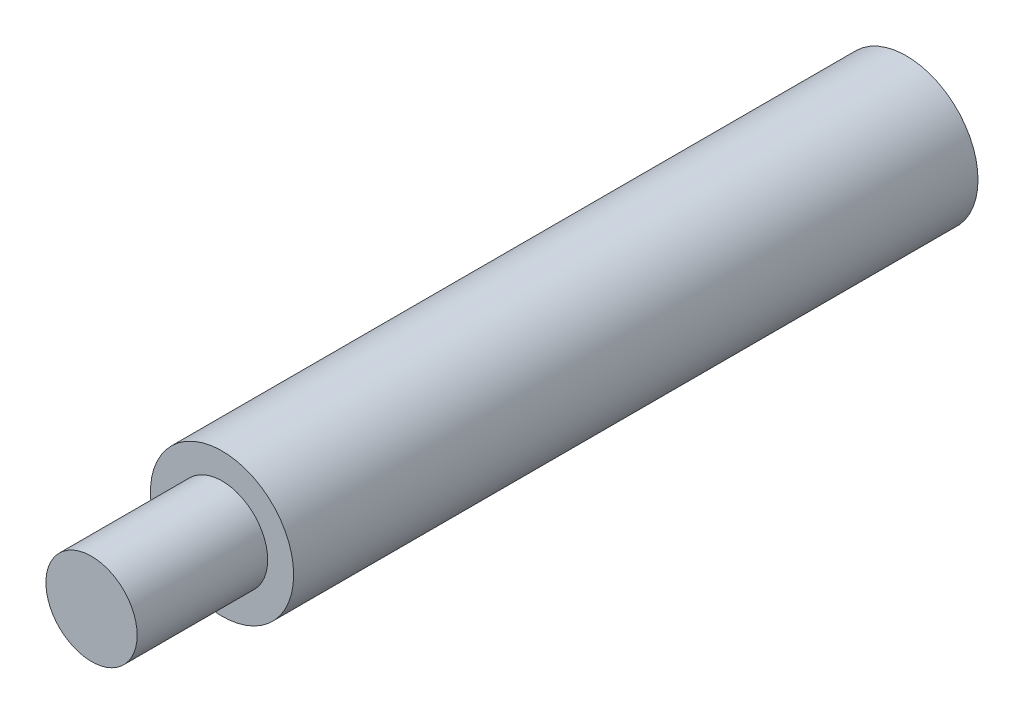
ISO-10303-21;
HEADER;
FILE_DESCRIPTION(('STEP AP214'),'2;1');
FILE_NAME('part.step','',(''),(''),'','','');
FILE_SCHEMA(('AUTOMOTIVE_DESIGN { 1 0 10303 214 1 1 1 1 }'));
ENDSEC;
DATA;
#1=APPLICATION_CONTEXT('core data for automotive mechanical design processes');
#2=APPLICATION_PROTOCOL_DEFINITION('international standard','automotive_design',2000,#1);
#3=PRODUCT_CONTEXT('',#1,'mechanical');
#4=PRODUCT('Part','Part','',(#3));
#5=PRODUCT_RELATED_PRODUCT_CATEGORY('part','',(#4));
#6=PRODUCT_DEFINITION_FORMATION('','',#4);
#7=PRODUCT_DEFINITION_CONTEXT('part definition',#1,'design');
#8=PRODUCT_DEFINITION('design','',#6,#7);
#9=PRODUCT_DEFINITION_SHAPE('','',#8);
#10=(LENGTH_UNIT() NAMED_UNIT(*) SI_UNIT(.MILLI.,.METRE.));
#11=(NAMED_UNIT(*) PLANE_ANGLE_UNIT() SI_UNIT($,.RADIAN.));
#12=(NAMED_UNIT(*) SI_UNIT($,.STERADIAN.) SOLID_ANGLE_UNIT());
#13=UNCERTAINTY_MEASURE_WITH_UNIT(LENGTH_MEASURE(1.E-05),#10,'distance_accuracy_value','');
#14=(GEOMETRIC_REPRESENTATION_CONTEXT(3) GLOBAL_UNCERTAINTY_ASSIGNED_CONTEXT((#13)) GLOBAL_UNIT_ASSIGNED_CONTEXT((#10,
#11,#12)) REPRESENTATION_CONTEXT('',''));
#15=CARTESIAN_POINT('',(0.,0.,0.));
#16=DIRECTION('',(0.,0.,1.));
#17=DIRECTION('',(1.,0.,0.));
#18=AXIS2_PLACEMENT_3D('',#15,#16,#17);
#19=CARTESIAN_POINT('',(0.,0.,17.86));
#20=DIRECTION('',(0.,0.,-1.));
#21=DIRECTION('',(-1.,0.,0.));
#22=AXIS2_PLACEMENT_3D('',#19,#20,#21);
#23=CYLINDRICAL_SURFACE('',#22,1.);
#24=CARTESIAN_POINT('',(0.,0.,15.));
#25=DIRECTION('',(0.,0.,1.));
#26=DIRECTION('',(1.,0.,0.));
#27=AXIS2_PLACEMENT_3D('',#24,#25,#26);
#28=CIRCLE('',#27,1.);
#29=CARTESIAN_POINT('',(1.,0.,15.));
#30=VERTEX_POINT('',#29);
#31=EDGE_CURVE('E40',#30,#30,#28,.T.);
#32=ORIENTED_EDGE('',*,*,#31,.T.);
#33=EDGE_LOOP('',(#32));
#34=FACE_BOUND('',#33,.T.);
#35=CARTESIAN_POINT('',(0.,0.,17.86));
#36=DIRECTION('',(0.,0.,1.));
#37=DIRECTION('',(1.,0.,0.));
#38=AXIS2_PLACEMENT_3D('',#35,#36,#37);
#39=CIRCLE('',#38,1.);
#40=CARTESIAN_POINT('',(1.,0.,17.86));
#41=VERTEX_POINT('',#40);
#42=EDGE_CURVE('E10',#41,#41,#39,.T.);
#43=ORIENTED_EDGE('',*,*,#42,.F.);
#44=EDGE_LOOP('',(#43));
#45=FACE_BOUND('',#44,.T.);
#46=ADVANCED_FACE('F37',(#34,#45),#23,.T.);
#47=CARTESIAN_POINT('',(0.,0.,17.86));
#48=DIRECTION('',(0.,0.,1.));
#49=DIRECTION('',(1.,0.,0.));
#50=AXIS2_PLACEMENT_3D('',#47,#48,#49);
#51=PLANE('',#50);
#52=ORIENTED_EDGE('',*,*,#42,.T.);
#53=EDGE_LOOP('',(#52));
#54=FACE_BOUND('',#53,.T.);
#55=ADVANCED_FACE('F64',(#54),#51,.T.);
#56=CARTESIAN_POINT('',(0.,0.,15.));
#57=DIRECTION('',(0.,0.,-1.));
#58=DIRECTION('',(-1.,0.,0.));
#59=AXIS2_PLACEMENT_3D('',#56,#57,#58);
#60=CYLINDRICAL_SURFACE('',#59,1.57);
#61=CARTESIAN_POINT('',(0.,0.,15.));
#62=DIRECTION('',(0.,0.,1.));
#63=DIRECTION('',(1.,0.,0.));
#64=AXIS2_PLACEMENT_3D('',#61,#62,#63);
#65=CIRCLE('',#64,1.57);
#66=CARTESIAN_POINT('',(1.57,0.,15.));
#67=VERTEX_POINT('',#66);
#68=EDGE_CURVE('E49',#67,#67,#65,.T.);
#69=ORIENTED_EDGE('',*,*,#68,.F.);
#70=EDGE_LOOP('',(#69));
#71=FACE_BOUND('',#70,.T.);
#72=CARTESIAN_POINT('',(0.,0.,0.));
#73=DIRECTION('',(0.,0.,1.));
#74=DIRECTION('',(1.,0.,0.));
#75=AXIS2_PLACEMENT_3D('',#72,#73,#74);
#76=CIRCLE('',#75,1.57);
#77=CARTESIAN_POINT('',(1.57,0.,0.));
#78=VERTEX_POINT('',#77);
#79=EDGE_CURVE('E51',#78,#78,#76,.T.);
#80=ORIENTED_EDGE('',*,*,#79,.T.);
#81=EDGE_LOOP('',(#80));
#82=FACE_BOUND('',#81,.T.);
#83=ADVANCED_FACE('F61',(#71,#82),#60,.T.);
#84=CARTESIAN_POINT('',(0.,0.,15.));
#85=DIRECTION('',(0.,0.,1.));
#86=DIRECTION('',(1.,0.,0.));
#87=AXIS2_PLACEMENT_3D('',#84,#85,#86);
#88=PLANE('',#87);
#89=ORIENTED_EDGE('',*,*,#31,.F.);
#90=EDGE_LOOP('',(#89));
#91=FACE_BOUND('',#90,.T.);
#92=ORIENTED_EDGE('',*,*,#68,.T.);
#93=EDGE_LOOP('',(#92));
#94=FACE_BOUND('',#93,.T.);
#95=ADVANCED_FACE('F59',(#91,#94),#88,.T.);
#96=CARTESIAN_POINT('',(0.,0.,0.));
#97=DIRECTION('',(0.,0.,1.));
#98=DIRECTION('',(1.,0.,0.));
#99=AXIS2_PLACEMENT_3D('',#96,#97,#98);
#100=PLANE('',#99);
#101=ORIENTED_EDGE('',*,*,#79,.F.);
#102=EDGE_LOOP('',(#101));
#103=FACE_BOUND('',#102,.T.);
#104=ADVANCED_FACE('F68',(#103),#100,.F.);
#105=CLOSED_SHELL('',(#46,#55,#83,#95,#104));
#106=MANIFOLD_SOLID_BREP('B2',#105);
#107=ADVANCED_BREP_SHAPE_REPRESENTATION('',(#18,#106),#14);
#108=SHAPE_DEFINITION_REPRESENTATION(#9,#107);
ENDSEC;
END-ISO-10303-21;
